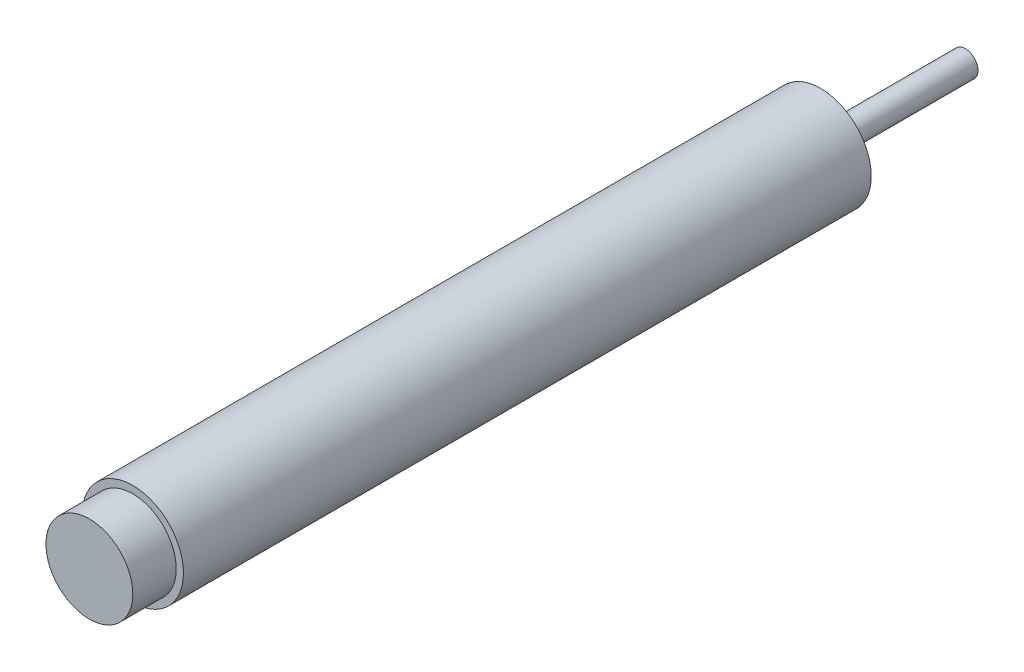
ISO-10303-21;
HEADER;
FILE_DESCRIPTION(('STEP AP214'),'2;1');
FILE_NAME('part.step','',(''),(''),'','','');
FILE_SCHEMA(('AUTOMOTIVE_DESIGN { 1 0 10303 214 1 1 1 1 }'));
ENDSEC;
DATA;
#1=APPLICATION_CONTEXT('core data for automotive mechanical design processes');
#2=APPLICATION_PROTOCOL_DEFINITION('international standard','automotive_design',2000,#1);
#3=PRODUCT_CONTEXT('',#1,'mechanical');
#4=PRODUCT('Part','Part','',(#3));
#5=PRODUCT_RELATED_PRODUCT_CATEGORY('part','',(#4));
#6=PRODUCT_DEFINITION_FORMATION('','',#4);
#7=PRODUCT_DEFINITION_CONTEXT('part definition',#1,'design');
#8=PRODUCT_DEFINITION('design','',#6,#7);
#9=PRODUCT_DEFINITION_SHAPE('','',#8);
#10=(LENGTH_UNIT() NAMED_UNIT(*) SI_UNIT(.MILLI.,.METRE.));
#11=(NAMED_UNIT(*) PLANE_ANGLE_UNIT() SI_UNIT($,.RADIAN.));
#12=(NAMED_UNIT(*) SI_UNIT($,.STERADIAN.) SOLID_ANGLE_UNIT());
#13=UNCERTAINTY_MEASURE_WITH_UNIT(LENGTH_MEASURE(1.E-05),#10,'distance_accuracy_value','');
#14=(GEOMETRIC_REPRESENTATION_CONTEXT(3) GLOBAL_UNCERTAINTY_ASSIGNED_CONTEXT((#13)) GLOBAL_UNIT_ASSIGNED_CONTEXT((#10,
#11,#12)) REPRESENTATION_CONTEXT('',''));
#15=CARTESIAN_POINT('',(0.,0.,0.));
#16=DIRECTION('',(0.,0.,1.));
#17=DIRECTION('',(1.,0.,0.));
#18=AXIS2_PLACEMENT_3D('',#15,#16,#17);
#19=CARTESIAN_POINT('',(0.,0.,95.));
#20=DIRECTION('',(0.,0.,1.));
#21=DIRECTION('',(1.,0.,0.));
#22=AXIS2_PLACEMENT_3D('',#19,#20,#21);
#23=PLANE('',#22);
#24=CARTESIAN_POINT('',(0.,0.,95.));
#25=DIRECTION('',(0.,0.,1.));
#26=DIRECTION('',(1.,0.,0.));
#27=AXIS2_PLACEMENT_3D('',#24,#25,#26);
#28=CIRCLE('',#27,7.);
#29=CARTESIAN_POINT('',(7.,0.,95.));
#30=VERTEX_POINT('',#29);
#31=EDGE_CURVE('E37',#30,#30,#28,.T.);
#32=ORIENTED_EDGE('',*,*,#31,.T.);
#33=EDGE_LOOP('',(#32));
#34=FACE_BOUND('',#33,.T.);
#35=CARTESIAN_POINT('',(0.,0.,95.));
#36=DIRECTION('',(0.,0.,1.));
#37=DIRECTION('',(1.,0.,0.));
#38=AXIS2_PLACEMENT_3D('',#35,#36,#37);
#39=CIRCLE('',#38,6.);
#40=CARTESIAN_POINT('',(6.,0.,95.));
#41=VERTEX_POINT('',#40);
#42=EDGE_CURVE('E51',#41,#41,#39,.T.);
#43=ORIENTED_EDGE('',*,*,#42,.F.);
#44=EDGE_LOOP('',(#43));
#45=FACE_BOUND('',#44,.T.);
#46=ADVANCED_FACE('F30',(#34,#45),#23,.T.);
#47=CARTESIAN_POINT('',(0.,0.,0.));
#48=DIRECTION('',(0.,0.,1.));
#49=DIRECTION('',(1.,0.,0.));
#50=AXIS2_PLACEMENT_3D('',#47,#48,#49);
#51=PLANE('',#50);
#52=CARTESIAN_POINT('',(0.,0.,0.));
#53=DIRECTION('',(0.,0.,1.));
#54=DIRECTION('',(1.,0.,0.));
#55=AXIS2_PLACEMENT_3D('',#52,#53,#54);
#56=CIRCLE('',#55,7.);
#57=CARTESIAN_POINT('',(7.,0.,0.));
#58=VERTEX_POINT('',#57);
#59=EDGE_CURVE('E41',#58,#58,#56,.T.);
#60=ORIENTED_EDGE('',*,*,#59,.F.);
#61=EDGE_LOOP('',(#60));
#62=FACE_BOUND('',#61,.T.);
#63=CARTESIAN_POINT('',(0.,0.,0.));
#64=DIRECTION('',(0.,0.,1.));
#65=DIRECTION('',(1.,0.,0.));
#66=AXIS2_PLACEMENT_3D('',#63,#64,#65);
#67=CIRCLE('',#66,1.75);
#68=CARTESIAN_POINT('',(1.75,0.,0.));
#69=VERTEX_POINT('',#68);
#70=EDGE_CURVE('E10',#69,#69,#67,.F.);
#71=ORIENTED_EDGE('',*,*,#70,.F.);
#72=EDGE_LOOP('',(#71));
#73=FACE_BOUND('',#72,.T.);
#74=ADVANCED_FACE('F67',(#62,#73),#51,.F.);
#75=CARTESIAN_POINT('',(0.,0.,95.));
#76=DIRECTION('',(0.,0.,-1.));
#77=DIRECTION('',(-1.,0.,0.));
#78=AXIS2_PLACEMENT_3D('',#75,#76,#77);
#79=CYLINDRICAL_SURFACE('',#78,7.);
#80=ORIENTED_EDGE('',*,*,#31,.F.);
#81=EDGE_LOOP('',(#80));
#82=FACE_BOUND('',#81,.T.);
#83=ORIENTED_EDGE('',*,*,#59,.T.);
#84=EDGE_LOOP('',(#83));
#85=FACE_BOUND('',#84,.T.);
#86=ADVANCED_FACE('F32',(#82,#85),#79,.T.);
#87=CARTESIAN_POINT('',(0.,0.,-20.));
#88=DIRECTION('',(0.,0.,1.));
#89=DIRECTION('',(1.,0.,0.));
#90=AXIS2_PLACEMENT_3D('',#87,#88,#89);
#91=CYLINDRICAL_SURFACE('',#90,1.75);
#92=CARTESIAN_POINT('',(0.,0.,-20.));
#93=DIRECTION('',(0.,0.,-1.));
#94=DIRECTION('',(-1.,0.,0.));
#95=AXIS2_PLACEMENT_3D('',#92,#93,#94);
#96=CIRCLE('',#95,1.75);
#97=CARTESIAN_POINT('',(-1.75,0.,-20.));
#98=VERTEX_POINT('',#97);
#99=EDGE_CURVE('E46',#98,#98,#96,.T.);
#100=ORIENTED_EDGE('',*,*,#99,.F.);
#101=EDGE_LOOP('',(#100));
#102=FACE_BOUND('',#101,.T.);
#103=ORIENTED_EDGE('',*,*,#70,.T.);
#104=EDGE_LOOP('',(#103));
#105=FACE_BOUND('',#104,.T.);
#106=ADVANCED_FACE('F74',(#102,#105),#91,.T.);
#107=CARTESIAN_POINT('',(0.,0.,-20.));
#108=DIRECTION('',(0.,0.,-1.));
#109=DIRECTION('',(-1.,0.,0.));
#110=AXIS2_PLACEMENT_3D('',#107,#108,#109);
#111=PLANE('',#110);
#112=ORIENTED_EDGE('',*,*,#99,.T.);
#113=EDGE_LOOP('',(#112));
#114=FACE_BOUND('',#113,.T.);
#115=ADVANCED_FACE('F62',(#114),#111,.T.);
#116=CARTESIAN_POINT('',(0.,0.,101.));
#117=DIRECTION('',(0.,0.,-1.));
#118=DIRECTION('',(-1.,0.,0.));
#119=AXIS2_PLACEMENT_3D('',#116,#117,#118);
#120=CYLINDRICAL_SURFACE('',#119,6.);
#121=CARTESIAN_POINT('',(0.,0.,101.));
#122=DIRECTION('',(0.,0.,1.));
#123=DIRECTION('',(1.,0.,0.));
#124=AXIS2_PLACEMENT_3D('',#121,#122,#123);
#125=CIRCLE('',#124,6.);
#126=CARTESIAN_POINT('',(6.,0.,101.));
#127=VERTEX_POINT('',#126);
#128=EDGE_CURVE('E50',#127,#127,#125,.T.);
#129=ORIENTED_EDGE('',*,*,#128,.F.);
#130=EDGE_LOOP('',(#129));
#131=FACE_BOUND('',#130,.T.);
#132=ORIENTED_EDGE('',*,*,#42,.T.);
#133=EDGE_LOOP('',(#132));
#134=FACE_BOUND('',#133,.T.);
#135=ADVANCED_FACE('F59',(#131,#134),#120,.T.);
#136=CARTESIAN_POINT('',(0.,0.,101.));
#137=DIRECTION('',(0.,0.,1.));
#138=DIRECTION('',(1.,0.,0.));
#139=AXIS2_PLACEMENT_3D('',#136,#137,#138);
#140=PLANE('',#139);
#141=ORIENTED_EDGE('',*,*,#128,.T.);
#142=EDGE_LOOP('',(#141));
#143=FACE_BOUND('',#142,.T.);
#144=ADVANCED_FACE('F57',(#143),#140,.T.);
#145=CLOSED_SHELL('',(#46,#74,#86,#106,#115,#135,#144));
#146=MANIFOLD_SOLID_BREP('B2',#145);
#147=ADVANCED_BREP_SHAPE_REPRESENTATION('',(#18,#146),#14);
#148=SHAPE_DEFINITION_REPRESENTATION(#9,#147);
ENDSEC;
END-ISO-10303-21;
